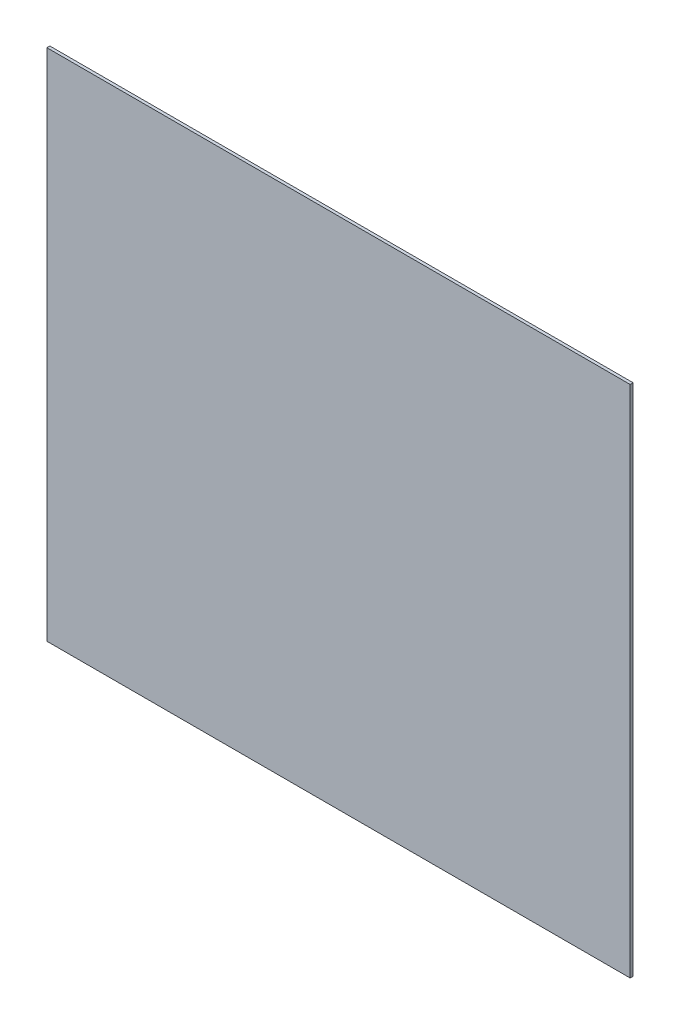
ISO-10303-21;
HEADER;
FILE_DESCRIPTION(('STEP AP214'),'2;1');
FILE_NAME('part.step','',(''),(''),'','','');
FILE_SCHEMA(('AUTOMOTIVE_DESIGN { 1 0 10303 214 1 1 1 1 }'));
ENDSEC;
DATA;
#1=APPLICATION_CONTEXT('core data for automotive mechanical design processes');
#2=APPLICATION_PROTOCOL_DEFINITION('international standard','automotive_design',2000,#1);
#3=PRODUCT_CONTEXT('',#1,'mechanical');
#4=PRODUCT('Part','Part','',(#3));
#5=PRODUCT_RELATED_PRODUCT_CATEGORY('part','',(#4));
#6=PRODUCT_DEFINITION_FORMATION('','',#4);
#7=PRODUCT_DEFINITION_CONTEXT('part definition',#1,'design');
#8=PRODUCT_DEFINITION('design','',#6,#7);
#9=PRODUCT_DEFINITION_SHAPE('','',#8);
#10=(LENGTH_UNIT() NAMED_UNIT(*) SI_UNIT(.MILLI.,.METRE.));
#11=(NAMED_UNIT(*) PLANE_ANGLE_UNIT() SI_UNIT($,.RADIAN.));
#12=(NAMED_UNIT(*) SI_UNIT($,.STERADIAN.) SOLID_ANGLE_UNIT());
#13=UNCERTAINTY_MEASURE_WITH_UNIT(LENGTH_MEASURE(1.E-05),#10,'distance_accuracy_value','');
#14=(GEOMETRIC_REPRESENTATION_CONTEXT(3) GLOBAL_UNCERTAINTY_ASSIGNED_CONTEXT((#13)) GLOBAL_UNIT_ASSIGNED_CONTEXT((#10,
#11,#12)) REPRESENTATION_CONTEXT('',''));
#15=CARTESIAN_POINT('',(0.,0.,0.));
#16=DIRECTION('',(0.,0.,1.));
#17=DIRECTION('',(1.,0.,0.));
#18=AXIS2_PLACEMENT_3D('',#15,#16,#17);
#19=CARTESIAN_POINT('',(147.5,-130.,-1.5));
#20=DIRECTION('',(1.,0.,0.));
#21=DIRECTION('',(0.,0.,-1.));
#22=AXIS2_PLACEMENT_3D('',#19,#20,#21);
#23=PLANE('',#22);
#24=DIRECTION('',(0.,1.,0.));
#25=VECTOR('',#24,1.);
#26=CARTESIAN_POINT('',(147.5,-130.,0.));
#27=LINE('',#26,#25);
#28=CARTESIAN_POINT('',(147.5,-130.,0.));
#29=VERTEX_POINT('',#28);
#30=CARTESIAN_POINT('',(147.5,130.,0.));
#31=VERTEX_POINT('',#30);
#32=EDGE_CURVE('E103',#29,#31,#27,.T.);
#33=ORIENTED_EDGE('',*,*,#32,.F.);
#34=DIRECTION('',(0.,0.,1.));
#35=VECTOR('',#34,1.);
#36=CARTESIAN_POINT('',(147.5,-130.,-1.5));
#37=LINE('',#36,#35);
#38=CARTESIAN_POINT('',(147.5,-130.,-1.5));
#39=VERTEX_POINT('',#38);
#40=EDGE_CURVE('E11',#39,#29,#37,.T.);
#41=ORIENTED_EDGE('',*,*,#40,.F.);
#42=DIRECTION('',(0.,1.,0.));
#43=VECTOR('',#42,1.);
#44=CARTESIAN_POINT('',(147.5,-130.,-1.5));
#45=LINE('',#44,#43);
#46=CARTESIAN_POINT('',(147.5,130.,-1.5));
#47=VERTEX_POINT('',#46);
#48=EDGE_CURVE('E97',#39,#47,#45,.T.);
#49=ORIENTED_EDGE('',*,*,#48,.T.);
#50=DIRECTION('',(0.,0.,1.));
#51=VECTOR('',#50,1.);
#52=CARTESIAN_POINT('',(147.5,130.,-1.5));
#53=LINE('',#52,#51);
#54=EDGE_CURVE('E42',#47,#31,#53,.T.);
#55=ORIENTED_EDGE('',*,*,#54,.T.);
#56=EDGE_LOOP('',(#33,#41,#49,#55));
#57=FACE_BOUND('',#56,.T.);
#58=ADVANCED_FACE('F39',(#57),#23,.T.);
#59=CARTESIAN_POINT('',(-147.5,-130.,-1.5));
#60=DIRECTION('',(0.,-1.,0.));
#61=DIRECTION('',(0.,0.,-1.));
#62=AXIS2_PLACEMENT_3D('',#59,#60,#61);
#63=PLANE('',#62);
#64=DIRECTION('',(1.,0.,0.));
#65=VECTOR('',#64,1.);
#66=CARTESIAN_POINT('',(-147.5,-130.,0.));
#67=LINE('',#66,#65);
#68=CARTESIAN_POINT('',(-147.5,-130.,0.));
#69=VERTEX_POINT('',#68);
#70=EDGE_CURVE('E99',#69,#29,#67,.T.);
#71=ORIENTED_EDGE('',*,*,#70,.F.);
#72=DIRECTION('',(0.,0.,1.));
#73=VECTOR('',#72,1.);
#74=CARTESIAN_POINT('',(-147.5,-130.,-1.5));
#75=LINE('',#74,#73);
#76=CARTESIAN_POINT('',(-147.5,-130.,-1.5));
#77=VERTEX_POINT('',#76);
#78=EDGE_CURVE('E48',#77,#69,#75,.T.);
#79=ORIENTED_EDGE('',*,*,#78,.F.);
#80=DIRECTION('',(1.,0.,0.));
#81=VECTOR('',#80,1.);
#82=CARTESIAN_POINT('',(-147.5,-130.,-1.5));
#83=LINE('',#82,#81);
#84=EDGE_CURVE('E94',#77,#39,#83,.T.);
#85=ORIENTED_EDGE('',*,*,#84,.T.);
#86=ORIENTED_EDGE('',*,*,#40,.T.);
#87=EDGE_LOOP('',(#71,#79,#85,#86));
#88=FACE_BOUND('',#87,.T.);
#89=ADVANCED_FACE('F113',(#88),#63,.T.);
#90=CARTESIAN_POINT('',(-147.5,-130.,-1.5));
#91=DIRECTION('',(-1.,0.,0.));
#92=DIRECTION('',(0.,0.,1.));
#93=AXIS2_PLACEMENT_3D('',#90,#91,#92);
#94=PLANE('',#93);
#95=DIRECTION('',(0.,-1.,0.));
#96=VECTOR('',#95,1.);
#97=CARTESIAN_POINT('',(-147.5,-130.,0.));
#98=LINE('',#97,#96);
#99=CARTESIAN_POINT('',(-147.5,130.,0.));
#100=VERTEX_POINT('',#99);
#101=EDGE_CURVE('E89',#100,#69,#98,.T.);
#102=ORIENTED_EDGE('',*,*,#101,.F.);
#103=DIRECTION('',(0.,0.,1.));
#104=VECTOR('',#103,1.);
#105=CARTESIAN_POINT('',(-147.5,130.,-1.5));
#106=LINE('',#105,#104);
#107=CARTESIAN_POINT('',(-147.5,130.,-1.5));
#108=VERTEX_POINT('',#107);
#109=EDGE_CURVE('E84',#108,#100,#106,.T.);
#110=ORIENTED_EDGE('',*,*,#109,.F.);
#111=DIRECTION('',(0.,-1.,0.));
#112=VECTOR('',#111,1.);
#113=CARTESIAN_POINT('',(-147.5,-130.,-1.5));
#114=LINE('',#113,#112);
#115=EDGE_CURVE('E87',#108,#77,#114,.T.);
#116=ORIENTED_EDGE('',*,*,#115,.T.);
#117=ORIENTED_EDGE('',*,*,#78,.T.);
#118=EDGE_LOOP('',(#102,#110,#116,#117));
#119=FACE_BOUND('',#118,.T.);
#120=ADVANCED_FACE('F86',(#119),#94,.T.);
#121=CARTESIAN_POINT('',(-147.5,130.,-1.5));
#122=DIRECTION('',(0.,1.,0.));
#123=DIRECTION('',(0.,0.,1.));
#124=AXIS2_PLACEMENT_3D('',#121,#122,#123);
#125=PLANE('',#124);
#126=DIRECTION('',(-1.,0.,0.));
#127=VECTOR('',#126,1.);
#128=CARTESIAN_POINT('',(-147.5,130.,0.));
#129=LINE('',#128,#127);
#130=EDGE_CURVE('E106',#31,#100,#129,.T.);
#131=ORIENTED_EDGE('',*,*,#130,.F.);
#132=ORIENTED_EDGE('',*,*,#54,.F.);
#133=DIRECTION('',(-1.,0.,0.));
#134=VECTOR('',#133,1.);
#135=CARTESIAN_POINT('',(-147.5,130.,-1.5));
#136=LINE('',#135,#134);
#137=EDGE_CURVE('E93',#47,#108,#136,.T.);
#138=ORIENTED_EDGE('',*,*,#137,.T.);
#139=ORIENTED_EDGE('',*,*,#109,.T.);
#140=EDGE_LOOP('',(#131,#132,#138,#139));
#141=FACE_BOUND('',#140,.T.);
#142=ADVANCED_FACE('F96',(#141),#125,.T.);
#143=CARTESIAN_POINT('',(0.,0.,-1.5));
#144=DIRECTION('',(0.,0.,-1.));
#145=DIRECTION('',(-1.,0.,0.));
#146=AXIS2_PLACEMENT_3D('',#143,#144,#145);
#147=PLANE('',#146);
#148=ORIENTED_EDGE('',*,*,#48,.F.);
#149=ORIENTED_EDGE('',*,*,#84,.F.);
#150=ORIENTED_EDGE('',*,*,#115,.F.);
#151=ORIENTED_EDGE('',*,*,#137,.F.);
#152=EDGE_LOOP('',(#148,#149,#150,#151));
#153=FACE_BOUND('',#152,.T.);
#154=ADVANCED_FACE('F92',(#153),#147,.T.);
#155=CARTESIAN_POINT('',(0.,0.,0.));
#156=DIRECTION('',(0.,0.,-1.));
#157=DIRECTION('',(-1.,0.,0.));
#158=AXIS2_PLACEMENT_3D('',#155,#156,#157);
#159=PLANE('',#158);
#160=ORIENTED_EDGE('',*,*,#32,.T.);
#161=ORIENTED_EDGE('',*,*,#130,.T.);
#162=ORIENTED_EDGE('',*,*,#101,.T.);
#163=ORIENTED_EDGE('',*,*,#70,.T.);
#164=EDGE_LOOP('',(#160,#161,#162,#163));
#165=FACE_BOUND('',#164,.T.);
#166=ADVANCED_FACE('F112',(#165),#159,.F.);
#167=CLOSED_SHELL('',(#58,#89,#120,#142,#154,#166));
#168=MANIFOLD_SOLID_BREP('B2',#167);
#169=ADVANCED_BREP_SHAPE_REPRESENTATION('',(#18,#168),#14);
#170=SHAPE_DEFINITION_REPRESENTATION(#9,#169);
ENDSEC;
END-ISO-10303-21;
